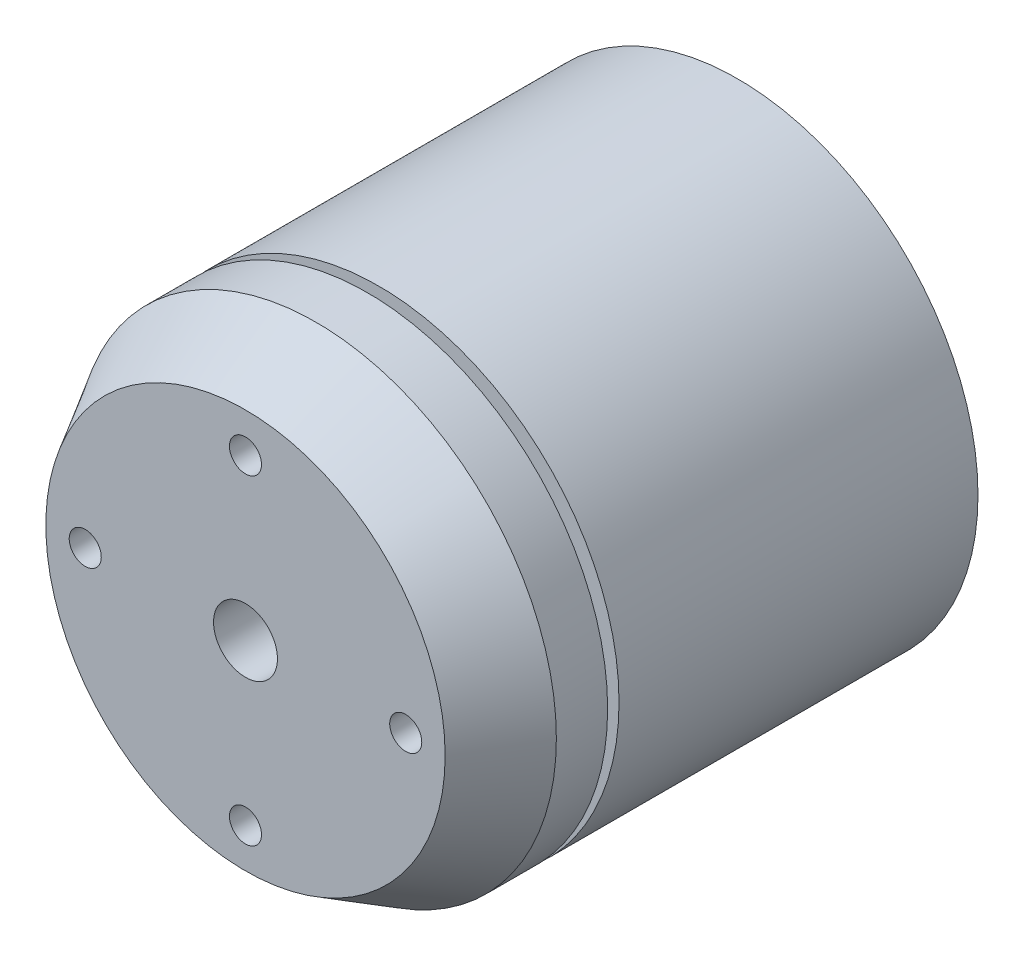
ISO-10303-21;
HEADER;
FILE_DESCRIPTION(('STEP AP214'),'2;1');
FILE_NAME('part.step','',(''),(''),'','','');
FILE_SCHEMA(('AUTOMOTIVE_DESIGN { 1 0 10303 214 1 1 1 1 }'));
ENDSEC;
DATA;
#1=APPLICATION_CONTEXT('core data for automotive mechanical design processes');
#2=APPLICATION_PROTOCOL_DEFINITION('international standard','automotive_design',2000,#1);
#3=PRODUCT_CONTEXT('',#1,'mechanical');
#4=PRODUCT('Part','Part','',(#3));
#5=PRODUCT_RELATED_PRODUCT_CATEGORY('part','',(#4));
#6=PRODUCT_DEFINITION_FORMATION('','',#4);
#7=PRODUCT_DEFINITION_CONTEXT('part definition',#1,'design');
#8=PRODUCT_DEFINITION('design','',#6,#7);
#9=PRODUCT_DEFINITION_SHAPE('','',#8);
#10=(LENGTH_UNIT() NAMED_UNIT(*) SI_UNIT(.MILLI.,.METRE.));
#11=(NAMED_UNIT(*) PLANE_ANGLE_UNIT() SI_UNIT($,.RADIAN.));
#12=(NAMED_UNIT(*) SI_UNIT($,.STERADIAN.) SOLID_ANGLE_UNIT());
#13=UNCERTAINTY_MEASURE_WITH_UNIT(LENGTH_MEASURE(1.E-05),#10,'distance_accuracy_value','');
#14=(GEOMETRIC_REPRESENTATION_CONTEXT(3) GLOBAL_UNCERTAINTY_ASSIGNED_CONTEXT((#13)) GLOBAL_UNIT_ASSIGNED_CONTEXT((#10,
#11,#12)) REPRESENTATION_CONTEXT('',''));
#15=CARTESIAN_POINT('',(0.,0.,0.));
#16=DIRECTION('',(0.,0.,1.));
#17=DIRECTION('',(1.,0.,0.));
#18=AXIS2_PLACEMENT_3D('',#15,#16,#17);
#19=CARTESIAN_POINT('',(0.,0.,0.));
#20=DIRECTION('',(0.,0.,1.));
#21=DIRECTION('',(1.,0.,0.));
#22=AXIS2_PLACEMENT_3D('',#19,#20,#21);
#23=CYLINDRICAL_SURFACE('',#22,14.2875);
#24=CARTESIAN_POINT('',(0.,0.,-10.389));
#25=DIRECTION('',(0.,0.,1.));
#26=DIRECTION('',(1.,0.,0.));
#27=AXIS2_PLACEMENT_3D('',#24,#25,#26);
#28=CIRCLE('',#27,14.2875);
#29=CARTESIAN_POINT('',(14.2875,0.,-10.389));
#30=VERTEX_POINT('',#29);
#31=EDGE_CURVE('E108',#30,#30,#28,.T.);
#32=ORIENTED_EDGE('',*,*,#31,.T.);
#33=EDGE_LOOP('',(#32));
#34=FACE_BOUND('',#33,.T.);
#35=CARTESIAN_POINT('',(0.,0.,-9.5));
#36=DIRECTION('',(0.,0.,1.));
#37=DIRECTION('',(1.,0.,0.));
#38=AXIS2_PLACEMENT_3D('',#35,#36,#37);
#39=CIRCLE('',#38,14.2875);
#40=CARTESIAN_POINT('',(14.2875,0.,-9.5));
#41=VERTEX_POINT('',#40);
#42=EDGE_CURVE('E11',#41,#41,#39,.T.);
#43=ORIENTED_EDGE('',*,*,#42,.F.);
#44=EDGE_LOOP('',(#43));
#45=FACE_BOUND('',#44,.T.);
#46=ADVANCED_FACE('F44',(#34,#45),#23,.T.);
#47=CARTESIAN_POINT('',(0.,0.,-9.5));
#48=DIRECTION('',(0.,0.,-1.));
#49=DIRECTION('',(-1.,0.,0.));
#50=AXIS2_PLACEMENT_3D('',#47,#48,#49);
#51=PLANE('',#50);
#52=ORIENTED_EDGE('',*,*,#42,.T.);
#53=EDGE_LOOP('',(#52));
#54=FACE_BOUND('',#53,.T.);
#55=CARTESIAN_POINT('',(0.,0.,-9.5));
#56=DIRECTION('',(0.,0.,1.));
#57=DIRECTION('',(1.,0.,0.));
#58=AXIS2_PLACEMENT_3D('',#55,#56,#57);
#59=CIRCLE('',#58,18.75);
#60=CARTESIAN_POINT('',(18.75,0.,-9.5));
#61=VERTEX_POINT('',#60);
#62=EDGE_CURVE('E52',#61,#61,#59,.T.);
#63=ORIENTED_EDGE('',*,*,#62,.F.);
#64=EDGE_LOOP('',(#63));
#65=FACE_BOUND('',#64,.T.);
#66=ADVANCED_FACE('F142',(#54,#65),#51,.T.);
#67=CARTESIAN_POINT('',(0.,0.,0.));
#68=DIRECTION('',(0.,0.,1.));
#69=DIRECTION('',(1.,0.,0.));
#70=AXIS2_PLACEMENT_3D('',#67,#68,#69);
#71=CYLINDRICAL_SURFACE('',#70,18.75);
#72=ORIENTED_EDGE('',*,*,#62,.T.);
#73=EDGE_LOOP('',(#72));
#74=FACE_BOUND('',#73,.T.);
#75=CARTESIAN_POINT('',(0.,0.,-5.5));
#76=DIRECTION('',(0.,0.,1.));
#77=DIRECTION('',(1.,0.,0.));
#78=AXIS2_PLACEMENT_3D('',#75,#76,#77);
#79=CIRCLE('',#78,18.75);
#80=CARTESIAN_POINT('',(18.75,0.,-5.5));
#81=VERTEX_POINT('',#80);
#82=EDGE_CURVE('E132',#81,#81,#79,.T.);
#83=ORIENTED_EDGE('',*,*,#82,.F.);
#84=EDGE_LOOP('',(#83));
#85=FACE_BOUND('',#84,.T.);
#86=ADVANCED_FACE('F139',(#74,#85),#71,.T.);
#87=CARTESIAN_POINT('',(0.,0.,0.));
#88=DIRECTION('',(0.,0.,-1.));
#89=DIRECTION('',(-1.,0.,0.));
#90=AXIS2_PLACEMENT_3D('',#87,#88,#89);
#91=CONICAL_SURFACE('',#90,15.574573519457,0.5235987755983);
#92=ORIENTED_EDGE('',*,*,#82,.T.);
#93=EDGE_LOOP('',(#92));
#94=FACE_BOUND('',#93,.T.);
#95=CARTESIAN_POINT('',(0.,0.,0.));
#96=DIRECTION('',(0.,0.,1.));
#97=DIRECTION('',(1.,0.,0.));
#98=AXIS2_PLACEMENT_3D('',#95,#96,#97);
#99=CIRCLE('',#98,15.574573519457);
#100=CARTESIAN_POINT('',(15.574573519457,0.,0.));
#101=VERTEX_POINT('',#100);
#102=EDGE_CURVE('E128',#101,#101,#99,.T.);
#103=ORIENTED_EDGE('',*,*,#102,.F.);
#104=EDGE_LOOP('',(#103));
#105=FACE_BOUND('',#104,.T.);
#106=ADVANCED_FACE('F149',(#94,#105),#91,.T.);
#107=CARTESIAN_POINT('',(0.,0.,0.));
#108=DIRECTION('',(0.,0.,1.));
#109=DIRECTION('',(1.,0.,0.));
#110=AXIS2_PLACEMENT_3D('',#107,#108,#109);
#111=PLANE('',#110);
#112=CARTESIAN_POINT('',(0.,0.,0.));
#113=DIRECTION('',(0.,0.,1.));
#114=DIRECTION('',(1.,0.,0.));
#115=AXIS2_PLACEMENT_3D('',#112,#113,#114);
#116=CIRCLE('',#115,2.49301);
#117=CARTESIAN_POINT('',(2.49301,0.,0.));
#118=VERTEX_POINT('',#117);
#119=EDGE_CURVE('E86',#118,#118,#116,.T.);
#120=ORIENTED_EDGE('',*,*,#119,.F.);
#121=EDGE_LOOP('',(#120));
#122=FACE_BOUND('',#121,.T.);
#123=CARTESIAN_POINT('',(0.,12.5,0.));
#124=DIRECTION('',(0.,0.,1.));
#125=DIRECTION('',(1.,0.,0.));
#126=AXIS2_PLACEMENT_3D('',#123,#124,#125);
#127=CIRCLE('',#126,1.25);
#128=CARTESIAN_POINT('',(1.25,12.5,0.));
#129=VERTEX_POINT('',#128);
#130=EDGE_CURVE('E78',#129,#129,#127,.T.);
#131=ORIENTED_EDGE('',*,*,#130,.F.);
#132=EDGE_LOOP('',(#131));
#133=FACE_BOUND('',#132,.T.);
#134=CARTESIAN_POINT('',(12.5,0.,0.));
#135=DIRECTION('',(0.,0.,1.));
#136=DIRECTION('',(1.,0.,0.));
#137=AXIS2_PLACEMENT_3D('',#134,#135,#136);
#138=CIRCLE('',#137,1.25);
#139=CARTESIAN_POINT('',(13.75,0.,0.));
#140=VERTEX_POINT('',#139);
#141=EDGE_CURVE('E77',#140,#140,#138,.T.);
#142=ORIENTED_EDGE('',*,*,#141,.F.);
#143=EDGE_LOOP('',(#142));
#144=FACE_BOUND('',#143,.T.);
#145=CARTESIAN_POINT('',(-12.5,0.,0.));
#146=DIRECTION('',(0.,0.,1.));
#147=DIRECTION('',(1.,0.,0.));
#148=AXIS2_PLACEMENT_3D('',#145,#146,#147);
#149=CIRCLE('',#148,1.25);
#150=CARTESIAN_POINT('',(-11.25,0.,0.));
#151=VERTEX_POINT('',#150);
#152=EDGE_CURVE('E93',#151,#151,#149,.T.);
#153=ORIENTED_EDGE('',*,*,#152,.F.);
#154=EDGE_LOOP('',(#153));
#155=FACE_BOUND('',#154,.T.);
#156=CARTESIAN_POINT('',(0.,-12.5,0.));
#157=DIRECTION('',(0.,0.,1.));
#158=DIRECTION('',(1.,0.,0.));
#159=AXIS2_PLACEMENT_3D('',#156,#157,#158);
#160=CIRCLE('',#159,1.25);
#161=CARTESIAN_POINT('',(1.25,-12.5,0.));
#162=VERTEX_POINT('',#161);
#163=EDGE_CURVE('E100',#162,#162,#160,.T.);
#164=ORIENTED_EDGE('',*,*,#163,.F.);
#165=EDGE_LOOP('',(#164));
#166=FACE_BOUND('',#165,.T.);
#167=ORIENTED_EDGE('',*,*,#102,.T.);
#168=EDGE_LOOP('',(#167));
#169=FACE_BOUND('',#168,.T.);
#170=ADVANCED_FACE('F155',(#122,#133,#144,#155,#166,#169),#111,.T.);
#171=CARTESIAN_POINT('',(0.,0.,-45.75));
#172=DIRECTION('',(0.,0.,-1.));
#173=DIRECTION('',(-1.,0.,0.));
#174=AXIS2_PLACEMENT_3D('',#171,#172,#173);
#175=PLANE('',#174);
#176=CARTESIAN_POINT('',(0.,0.,-45.75));
#177=DIRECTION('',(0.,0.,-1.));
#178=DIRECTION('',(-1.,0.,0.));
#179=AXIS2_PLACEMENT_3D('',#176,#177,#178);
#180=CIRCLE('',#179,2.49301);
#181=CARTESIAN_POINT('',(-2.49301,0.,-45.75));
#182=VERTEX_POINT('',#181);
#183=EDGE_CURVE('E211',#182,#182,#180,.F.);
#184=ORIENTED_EDGE('',*,*,#183,.T.);
#185=EDGE_LOOP('',(#184));
#186=FACE_BOUND('',#185,.T.);
#187=CARTESIAN_POINT('',(0.,0.,-45.75));
#188=DIRECTION('',(0.,0.,1.));
#189=DIRECTION('',(1.,0.,0.));
#190=AXIS2_PLACEMENT_3D('',#187,#188,#189);
#191=CIRCLE('',#190,6.);
#192=CARTESIAN_POINT('',(6.,0.,-45.75));
#193=VERTEX_POINT('',#192);
#194=EDGE_CURVE('E124',#193,#193,#191,.T.);
#195=ORIENTED_EDGE('',*,*,#194,.F.);
#196=EDGE_LOOP('',(#195));
#197=FACE_BOUND('',#196,.T.);
#198=ADVANCED_FACE('F159',(#186,#197),#175,.T.);
#199=CARTESIAN_POINT('',(0.,0.,0.));
#200=DIRECTION('',(0.,0.,1.));
#201=DIRECTION('',(1.,0.,0.));
#202=AXIS2_PLACEMENT_3D('',#199,#200,#201);
#203=CYLINDRICAL_SURFACE('',#202,6.);
#204=ORIENTED_EDGE('',*,*,#194,.T.);
#205=EDGE_LOOP('',(#204));
#206=FACE_BOUND('',#205,.T.);
#207=CARTESIAN_POINT('',(0.,0.,-39.75));
#208=DIRECTION('',(0.,0.,1.));
#209=DIRECTION('',(1.,0.,0.));
#210=AXIS2_PLACEMENT_3D('',#207,#208,#209);
#211=CIRCLE('',#210,6.);
#212=CARTESIAN_POINT('',(5.99999999999996,0.,-39.75));
#213=VERTEX_POINT('',#212);
#214=EDGE_CURVE('E120',#213,#213,#211,.T.);
#215=ORIENTED_EDGE('',*,*,#214,.F.);
#216=EDGE_LOOP('',(#215));
#217=FACE_BOUND('',#216,.T.);
#218=ADVANCED_FACE('F163',(#206,#217),#203,.T.);
#219=CARTESIAN_POINT('',(0.,0.,-38.389));
#220=DIRECTION('',(0.,0.,1.));
#221=DIRECTION('',(1.,0.,0.));
#222=AXIS2_PLACEMENT_3D('',#219,#220,#221);
#223=CONICAL_SURFACE('',#222,18.75,1.46445391550861);
#224=CARTESIAN_POINT('',(0.,0.,-38.389));
#225=DIRECTION('',(0.,0.,1.));
#226=DIRECTION('',(1.,0.,0.));
#227=AXIS2_PLACEMENT_3D('',#224,#225,#226);
#228=CIRCLE('',#227,18.75);
#229=CARTESIAN_POINT('',(18.75,0.,-38.389));
#230=VERTEX_POINT('',#229);
#231=EDGE_CURVE('E116',#230,#230,#228,.T.);
#232=CARTESIAN_POINT('',(5.99999999999996,0.,-39.75));
#233=CARTESIAN_POINT('',(6.13281249999996,0.,-39.7358229166667));
#234=CARTESIAN_POINT('',(6.26562499999996,0.,-39.7216458333333));
#235=CARTESIAN_POINT('',(6.53124999999996,0.,-39.6932916666667));
#236=CARTESIAN_POINT('',(6.66406249999996,0.,-39.6791145833333));
#237=CARTESIAN_POINT('',(6.92968749999996,0.,-39.6507604166667));
#238=CARTESIAN_POINT('',(7.06249999999996,0.,-39.6365833333333));
#239=CARTESIAN_POINT('',(7.32812499999996,0.,-39.6082291666667));
#240=CARTESIAN_POINT('',(7.46093749999996,0.,-39.5940520833333));
#241=CARTESIAN_POINT('',(7.72656249999996,0.,-39.5656979166667));
#242=CARTESIAN_POINT('',(7.85937499999996,0.,-39.5515208333333));
#243=CARTESIAN_POINT('',(8.12499999999996,0.,-39.5231666666667));
#244=CARTESIAN_POINT('',(8.25781249999996,0.,-39.5089895833333));
#245=CARTESIAN_POINT('',(8.52343749999996,0.,-39.4806354166667));
#246=CARTESIAN_POINT('',(8.65624999999996,0.,-39.4664583333333));
#247=CARTESIAN_POINT('',(8.92187499999996,0.,-39.4381041666667));
#248=CARTESIAN_POINT('',(9.05468749999996,0.,-39.4239270833333));
#249=CARTESIAN_POINT('',(9.32031249999996,0.,-39.3955729166667));
#250=CARTESIAN_POINT('',(9.45312499999996,0.,-39.3813958333333));
#251=CARTESIAN_POINT('',(9.71874999999996,0.,-39.3530416666667));
#252=CARTESIAN_POINT('',(9.85156249999996,0.,-39.3388645833333));
#253=CARTESIAN_POINT('',(10.1171875,0.,-39.3105104166667));
#254=CARTESIAN_POINT('',(10.25,0.,-39.2963333333333));
#255=CARTESIAN_POINT('',(10.515625,0.,-39.2679791666667));
#256=CARTESIAN_POINT('',(10.6484375,0.,-39.2538020833333));
#257=CARTESIAN_POINT('',(10.9140625,0.,-39.2254479166667));
#258=CARTESIAN_POINT('',(11.046875,0.,-39.2112708333333));
#259=CARTESIAN_POINT('',(11.3125,0.,-39.1829166666667));
#260=CARTESIAN_POINT('',(11.4453125,0.,-39.1687395833333));
#261=CARTESIAN_POINT('',(11.7109375,0.,-39.1403854166667));
#262=CARTESIAN_POINT('',(11.84375,0.,-39.1262083333333));
#263=CARTESIAN_POINT('',(12.109375,0.,-39.0978541666667));
#264=CARTESIAN_POINT('',(12.2421875,0.,-39.0836770833333));
#265=CARTESIAN_POINT('',(12.5078125,0.,-39.0553229166667));
#266=CARTESIAN_POINT('',(12.640625,0.,-39.0411458333333));
#267=CARTESIAN_POINT('',(12.90625,0.,-39.0127916666667));
#268=CARTESIAN_POINT('',(13.0390625,0.,-38.9986145833333));
#269=CARTESIAN_POINT('',(13.3046875,0.,-38.9702604166667));
#270=CARTESIAN_POINT('',(13.4375,0.,-38.9560833333333));
#271=CARTESIAN_POINT('',(13.703125,0.,-38.9277291666667));
#272=CARTESIAN_POINT('',(13.8359375,0.,-38.9135520833333));
#273=CARTESIAN_POINT('',(14.1015625,0.,-38.8851979166667));
#274=CARTESIAN_POINT('',(14.234375,0.,-38.8710208333333));
#275=CARTESIAN_POINT('',(14.5,0.,-38.8426666666667));
#276=CARTESIAN_POINT('',(14.6328125,0.,-38.8284895833334));
#277=CARTESIAN_POINT('',(14.8984375,0.,-38.8001354166667));
#278=CARTESIAN_POINT('',(15.03125,0.,-38.7859583333333));
#279=CARTESIAN_POINT('',(15.296875,0.,-38.7576041666667));
#280=CARTESIAN_POINT('',(15.4296875,0.,-38.7434270833333));
#281=CARTESIAN_POINT('',(15.6953125,0.,-38.7150729166667));
#282=CARTESIAN_POINT('',(15.828125,0.,-38.7008958333333));
#283=CARTESIAN_POINT('',(16.09375,0.,-38.6725416666667));
#284=CARTESIAN_POINT('',(16.2265625,0.,-38.6583645833333));
#285=CARTESIAN_POINT('',(16.4921875,0.,-38.6300104166667));
#286=CARTESIAN_POINT('',(16.625,0.,-38.6158333333333));
#287=CARTESIAN_POINT('',(16.890625,0.,-38.5874791666667));
#288=CARTESIAN_POINT('',(17.0234375,0.,-38.5733020833333));
#289=CARTESIAN_POINT('',(17.2890625,0.,-38.5449479166667));
#290=CARTESIAN_POINT('',(17.421875,0.,-38.5307708333333));
#291=CARTESIAN_POINT('',(17.6875,0.,-38.5024166666667));
#292=CARTESIAN_POINT('',(17.8203125,0.,-38.4882395833333));
#293=CARTESIAN_POINT('',(18.0859375,0.,-38.4598854166667));
#294=CARTESIAN_POINT('',(18.21875,0.,-38.4457083333333));
#295=CARTESIAN_POINT('',(18.484375,0.,-38.4173541666667));
#296=CARTESIAN_POINT('',(18.6171875,0.,-38.4031770833333));
#297=CARTESIAN_POINT('',(18.75,0.,-38.389));
#298=B_SPLINE_CURVE_WITH_KNOTS('',3,(#232,#233,#234,#235,#236,#237,#238,#239,#240,#241,#242,
#243,#244,#245,#246,#247,#248,#249,#250,#251,#252,#253,#254,#255,#256,#257,#258,#259,#260,#261,
#262,#263,#264,#265,#266,#267,#268,#269,#270,#271,#272,#273,#274,#275,#276,#277,#278,#279,#280,
#281,#282,#283,#284,#285,#286,#287,#288,#289,#290,#291,#292,#293,#294,#295,#296,#297),
.UNSPECIFIED.,.F.,.F.,(4,2,2,2,2,2,2,2,2,2,2,2,2,2,2,2,2,2,2,2,2,2,2,2,2,2,2,2,2,2,2,2,4),(0.,
0.400701071414605,0.801402142829211,1.20210321424382,1.60280428565842,2.00350535707303,
2.40420642848763,2.80490749990224,3.20560857131684,3.60630964273145,4.00701071414605,
4.40771178556066,4.80841285697526,5.20911392838987,5.60981499980447,6.01051607121908,
6.41121714263368,6.81191821404829,7.21261928546289,7.6133203568775,8.0140214282921,
8.41472249970671,8.81542357112132,9.21612464253592,9.61682571395053,10.0175267853651,
10.4182278567797,10.8189289281943,11.2196299996089,11.6203310710236,12.0210321424382,
12.4217332138528,12.8224342852674),.UNSPECIFIED.);
#299=EDGE_CURVE('BSEAM167',#213,#230,#298,.T.);
#300=ORIENTED_EDGE('',*,*,#214,.T.);
#301=ORIENTED_EDGE('',*,*,#231,.F.);
#302=ORIENTED_EDGE('',*,*,#299,.T.);
#303=ORIENTED_EDGE('',*,*,#299,.F.);
#304=EDGE_LOOP('',(#300,#302,#301,#303));
#305=FACE_BOUND('',#304,.T.);
#306=ADVANCED_FACE('F167',(#305),#223,.T.);
#307=CARTESIAN_POINT('',(0.,0.,0.));
#308=DIRECTION('',(0.,0.,1.));
#309=DIRECTION('',(1.,0.,0.));
#310=AXIS2_PLACEMENT_3D('',#307,#308,#309);
#311=CYLINDRICAL_SURFACE('',#310,18.75);
#312=ORIENTED_EDGE('',*,*,#231,.T.);
#313=EDGE_LOOP('',(#312));
#314=FACE_BOUND('',#313,.T.);
#315=CARTESIAN_POINT('',(0.,0.,-10.389));
#316=DIRECTION('',(0.,0.,1.));
#317=DIRECTION('',(1.,0.,0.));
#318=AXIS2_PLACEMENT_3D('',#315,#316,#317);
#319=CIRCLE('',#318,18.75);
#320=CARTESIAN_POINT('',(18.75,0.,-10.389));
#321=VERTEX_POINT('',#320);
#322=EDGE_CURVE('E112',#321,#321,#319,.T.);
#323=ORIENTED_EDGE('',*,*,#322,.F.);
#324=EDGE_LOOP('',(#323));
#325=FACE_BOUND('',#324,.T.);
#326=ADVANCED_FACE('F171',(#314,#325),#311,.T.);
#327=CARTESIAN_POINT('',(0.,0.,-10.389));
#328=DIRECTION('',(0.,0.,1.));
#329=DIRECTION('',(1.,0.,0.));
#330=AXIS2_PLACEMENT_3D('',#327,#328,#329);
#331=PLANE('',#330);
#332=ORIENTED_EDGE('',*,*,#322,.T.);
#333=EDGE_LOOP('',(#332));
#334=FACE_BOUND('',#333,.T.);
#335=ORIENTED_EDGE('',*,*,#31,.F.);
#336=EDGE_LOOP('',(#335));
#337=FACE_BOUND('',#336,.T.);
#338=ADVANCED_FACE('F175',(#334,#337),#331,.T.);
#339=CARTESIAN_POINT('',(0.,-12.5,-7.62));
#340=DIRECTION('',(0.,0.,1.));
#341=DIRECTION('',(1.,0.,0.));
#342=AXIS2_PLACEMENT_3D('',#339,#340,#341);
#343=CONICAL_SURFACE('',#342,1.25,1.02974425867665);
#344=CARTESIAN_POINT('',(0.,-12.5,-8.37107577378445));
#345=VERTEX_POINT('',#344);
#346=VERTEX_LOOP('',#345);
#347=FACE_BOUND('',#346,.T.);
#348=CARTESIAN_POINT('',(0.,-12.5,-7.62));
#349=DIRECTION('',(0.,0.,1.));
#350=DIRECTION('',(1.,0.,0.));
#351=AXIS2_PLACEMENT_3D('',#348,#349,#350);
#352=CIRCLE('',#351,1.25);
#353=CARTESIAN_POINT('',(1.25,-12.5,-7.62));
#354=VERTEX_POINT('',#353);
#355=EDGE_CURVE('E104',#354,#354,#352,.T.);
#356=ORIENTED_EDGE('',*,*,#355,.T.);
#357=EDGE_LOOP('',(#356));
#358=FACE_BOUND('',#357,.T.);
#359=ADVANCED_FACE('F179',(#347,#358),#343,.F.);
#360=CARTESIAN_POINT('',(0.,-12.5,0.));
#361=DIRECTION('',(0.,0.,1.));
#362=DIRECTION('',(1.,0.,0.));
#363=AXIS2_PLACEMENT_3D('',#360,#361,#362);
#364=CYLINDRICAL_SURFACE('',#363,1.25);
#365=ORIENTED_EDGE('',*,*,#355,.F.);
#366=EDGE_LOOP('',(#365));
#367=FACE_BOUND('',#366,.T.);
#368=ORIENTED_EDGE('',*,*,#163,.T.);
#369=EDGE_LOOP('',(#368));
#370=FACE_BOUND('',#369,.T.);
#371=ADVANCED_FACE('F183',(#367,#370),#364,.F.);
#372=CARTESIAN_POINT('',(-12.5,0.,-7.62));
#373=DIRECTION('',(0.,0.,1.));
#374=DIRECTION('',(1.,0.,0.));
#375=AXIS2_PLACEMENT_3D('',#372,#373,#374);
#376=CONICAL_SURFACE('',#375,1.25,1.02974425867665);
#377=CARTESIAN_POINT('',(-12.5,0.,-8.37107577378445));
#378=VERTEX_POINT('',#377);
#379=VERTEX_LOOP('',#378);
#380=FACE_BOUND('',#379,.T.);
#381=CARTESIAN_POINT('',(-12.5,0.,-7.62));
#382=DIRECTION('',(0.,0.,1.));
#383=DIRECTION('',(1.,0.,0.));
#384=AXIS2_PLACEMENT_3D('',#381,#382,#383);
#385=CIRCLE('',#384,1.25);
#386=CARTESIAN_POINT('',(-11.25,0.,-7.62));
#387=VERTEX_POINT('',#386);
#388=EDGE_CURVE('E97',#387,#387,#385,.T.);
#389=ORIENTED_EDGE('',*,*,#388,.T.);
#390=EDGE_LOOP('',(#389));
#391=FACE_BOUND('',#390,.T.);
#392=ADVANCED_FACE('F186',(#380,#391),#376,.F.);
#393=CARTESIAN_POINT('',(-12.5,0.,0.));
#394=DIRECTION('',(0.,0.,1.));
#395=DIRECTION('',(1.,0.,0.));
#396=AXIS2_PLACEMENT_3D('',#393,#394,#395);
#397=CYLINDRICAL_SURFACE('',#396,1.25);
#398=ORIENTED_EDGE('',*,*,#388,.F.);
#399=EDGE_LOOP('',(#398));
#400=FACE_BOUND('',#399,.T.);
#401=ORIENTED_EDGE('',*,*,#152,.T.);
#402=EDGE_LOOP('',(#401));
#403=FACE_BOUND('',#402,.T.);
#404=ADVANCED_FACE('F190',(#400,#403),#397,.F.);
#405=CARTESIAN_POINT('',(12.5,0.,-7.62));
#406=DIRECTION('',(0.,0.,1.));
#407=DIRECTION('',(1.,0.,0.));
#408=AXIS2_PLACEMENT_3D('',#405,#406,#407);
#409=CONICAL_SURFACE('',#408,1.25,1.02974425867665);
#410=CARTESIAN_POINT('',(12.5,0.,-8.37107577378445));
#411=VERTEX_POINT('',#410);
#412=VERTEX_LOOP('',#411);
#413=FACE_BOUND('',#412,.T.);
#414=CARTESIAN_POINT('',(12.5,0.,-7.62));
#415=DIRECTION('',(0.,0.,1.));
#416=DIRECTION('',(1.,0.,0.));
#417=AXIS2_PLACEMENT_3D('',#414,#415,#416);
#418=CIRCLE('',#417,1.25);
#419=CARTESIAN_POINT('',(13.75,0.,-7.62));
#420=VERTEX_POINT('',#419);
#421=EDGE_CURVE('E82',#420,#420,#418,.T.);
#422=ORIENTED_EDGE('',*,*,#421,.T.);
#423=EDGE_LOOP('',(#422));
#424=FACE_BOUND('',#423,.T.);
#425=ADVANCED_FACE('F193',(#413,#424),#409,.F.);
#426=CARTESIAN_POINT('',(12.5,0.,0.));
#427=DIRECTION('',(0.,0.,1.));
#428=DIRECTION('',(1.,0.,0.));
#429=AXIS2_PLACEMENT_3D('',#426,#427,#428);
#430=CYLINDRICAL_SURFACE('',#429,1.25);
#431=ORIENTED_EDGE('',*,*,#421,.F.);
#432=EDGE_LOOP('',(#431));
#433=FACE_BOUND('',#432,.T.);
#434=ORIENTED_EDGE('',*,*,#141,.T.);
#435=EDGE_LOOP('',(#434));
#436=FACE_BOUND('',#435,.T.);
#437=ADVANCED_FACE('F71',(#433,#436),#430,.F.);
#438=CARTESIAN_POINT('',(0.,12.5,-7.62));
#439=DIRECTION('',(0.,0.,1.));
#440=DIRECTION('',(1.,0.,0.));
#441=AXIS2_PLACEMENT_3D('',#438,#439,#440);
#442=CONICAL_SURFACE('',#441,1.25,1.02974425867665);
#443=CARTESIAN_POINT('',(0.,12.5,-8.37107577378445));
#444=VERTEX_POINT('',#443);
#445=VERTEX_LOOP('',#444);
#446=FACE_BOUND('',#445,.T.);
#447=CARTESIAN_POINT('',(0.,12.5,-7.62));
#448=DIRECTION('',(0.,0.,1.));
#449=DIRECTION('',(1.,0.,0.));
#450=AXIS2_PLACEMENT_3D('',#447,#448,#449);
#451=CIRCLE('',#450,1.25);
#452=CARTESIAN_POINT('',(1.25,12.5,-7.62));
#453=VERTEX_POINT('',#452);
#454=EDGE_CURVE('E75',#453,#453,#451,.T.);
#455=ORIENTED_EDGE('',*,*,#454,.T.);
#456=EDGE_LOOP('',(#455));
#457=FACE_BOUND('',#456,.T.);
#458=ADVANCED_FACE('F67',(#446,#457),#442,.F.);
#459=CARTESIAN_POINT('',(0.,12.5,0.));
#460=DIRECTION('',(0.,0.,1.));
#461=DIRECTION('',(1.,0.,0.));
#462=AXIS2_PLACEMENT_3D('',#459,#460,#461);
#463=CYLINDRICAL_SURFACE('',#462,1.25);
#464=ORIENTED_EDGE('',*,*,#454,.F.);
#465=EDGE_LOOP('',(#464));
#466=FACE_BOUND('',#465,.T.);
#467=ORIENTED_EDGE('',*,*,#130,.T.);
#468=EDGE_LOOP('',(#467));
#469=FACE_BOUND('',#468,.T.);
#470=ADVANCED_FACE('F70',(#466,#469),#463,.F.);
#471=CARTESIAN_POINT('',(0.,0.,-45.751));
#472=DIRECTION('',(0.,0.,1.));
#473=DIRECTION('',(1.,0.,0.));
#474=AXIS2_PLACEMENT_3D('',#471,#472,#473);
#475=CYLINDRICAL_SURFACE('',#474,2.49301);
#476=ORIENTED_EDGE('',*,*,#183,.F.);
#477=EDGE_LOOP('',(#476));
#478=FACE_BOUND('',#477,.T.);
#479=ORIENTED_EDGE('',*,*,#119,.T.);
#480=EDGE_LOOP('',(#479));
#481=FACE_BOUND('',#480,.T.);
#482=ADVANCED_FACE('F203',(#478,#481),#475,.F.);
#483=CLOSED_SHELL('',(#46,#66,#86,#106,#170,#198,#218,#306,#326,#338,#359,#371,#392,#404,#425,
#437,#458,#470,#482));
#484=MANIFOLD_SOLID_BREP('B2',#483);
#485=ADVANCED_BREP_SHAPE_REPRESENTATION('',(#18,#484),#14);
#486=SHAPE_DEFINITION_REPRESENTATION(#9,#485);
ENDSEC;
END-ISO-10303-21;
